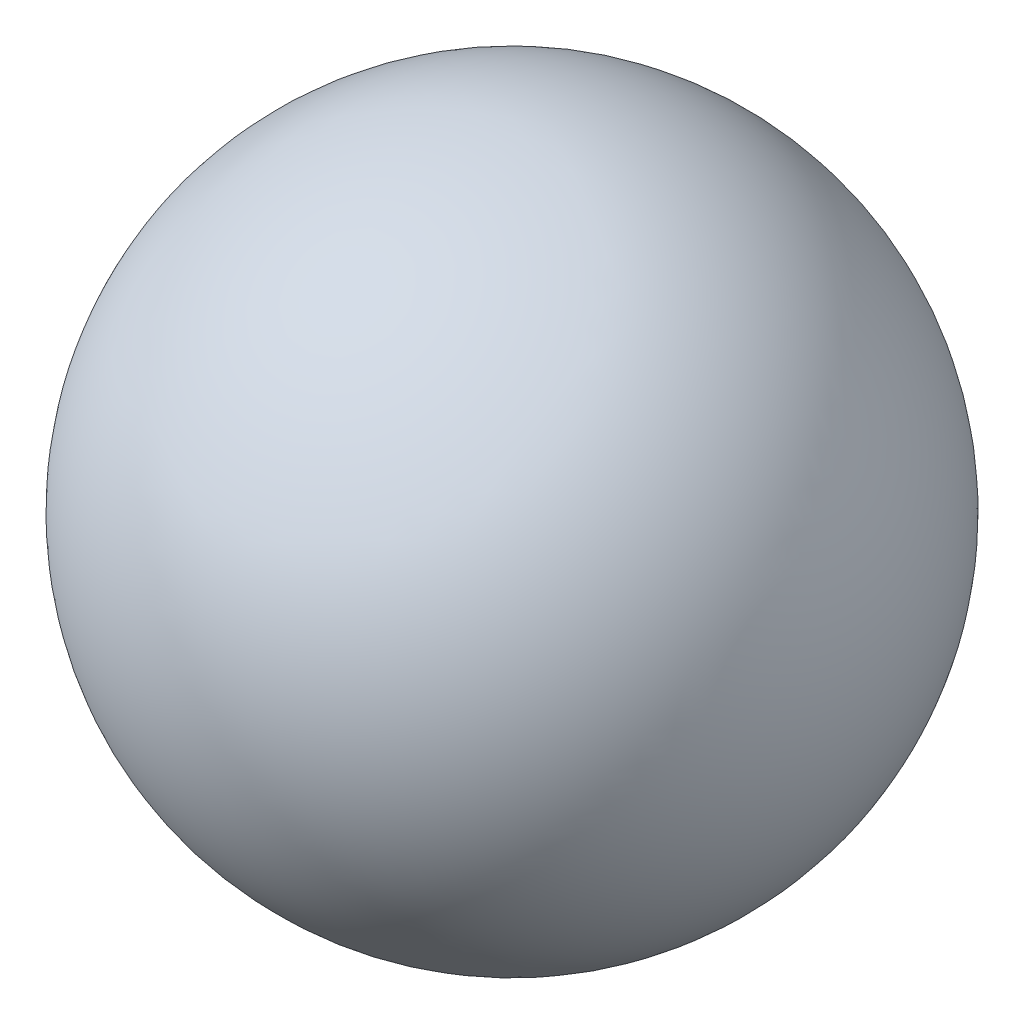
ISO-10303-21;
HEADER;
FILE_DESCRIPTION(('STEP AP214'),'2;1');
FILE_NAME('part.step','',(''),(''),'','','');
FILE_SCHEMA(('AUTOMOTIVE_DESIGN { 1 0 10303 214 1 1 1 1 }'));
ENDSEC;
DATA;
#1=APPLICATION_CONTEXT('core data for automotive mechanical design processes');
#2=APPLICATION_PROTOCOL_DEFINITION('international standard','automotive_design',2000,#1);
#3=PRODUCT_CONTEXT('',#1,'mechanical');
#4=PRODUCT('Part','Part','',(#3));
#5=PRODUCT_RELATED_PRODUCT_CATEGORY('part','',(#4));
#6=PRODUCT_DEFINITION_FORMATION('','',#4);
#7=PRODUCT_DEFINITION_CONTEXT('part definition',#1,'design');
#8=PRODUCT_DEFINITION('design','',#6,#7);
#9=PRODUCT_DEFINITION_SHAPE('','',#8);
#10=(LENGTH_UNIT() NAMED_UNIT(*) SI_UNIT(.MILLI.,.METRE.));
#11=(NAMED_UNIT(*) PLANE_ANGLE_UNIT() SI_UNIT($,.RADIAN.));
#12=(NAMED_UNIT(*) SI_UNIT($,.STERADIAN.) SOLID_ANGLE_UNIT());
#13=UNCERTAINTY_MEASURE_WITH_UNIT(LENGTH_MEASURE(1.E-05),#10,'distance_accuracy_value','');
#14=(GEOMETRIC_REPRESENTATION_CONTEXT(3) GLOBAL_UNCERTAINTY_ASSIGNED_CONTEXT((#13)) GLOBAL_UNIT_ASSIGNED_CONTEXT((#10,
#11,#12)) REPRESENTATION_CONTEXT('',''));
#15=CARTESIAN_POINT('',(0.,0.,0.));
#16=DIRECTION('',(0.,0.,1.));
#17=DIRECTION('',(1.,0.,0.));
#18=AXIS2_PLACEMENT_3D('',#15,#16,#17);
#19=CARTESIAN_POINT('',(0.,0.,0.));
#20=DIRECTION('',(-1.,0.,0.));
#21=DIRECTION('',(0.,0.,-1.));
#22=AXIS2_PLACEMENT_3D('',#19,#20,#21);
#23=SPHERICAL_SURFACE('',#22,1.607);
#24=CARTESIAN_POINT('',(-1.607,0.,0.));
#25=VERTEX_POINT('',#24);
#26=VERTEX_LOOP('',#25);
#27=FACE_BOUND('',#26,.T.);
#28=ADVANCED_FACE('F41',(#27),#23,.T.);
#29=CLOSED_SHELL('',(#28));
#30=MANIFOLD_SOLID_BREP('B2',#29);
#31=ADVANCED_BREP_SHAPE_REPRESENTATION('',(#18,#30),#14);
#32=SHAPE_DEFINITION_REPRESENTATION(#9,#31);
ENDSEC;
END-ISO-10303-21;
